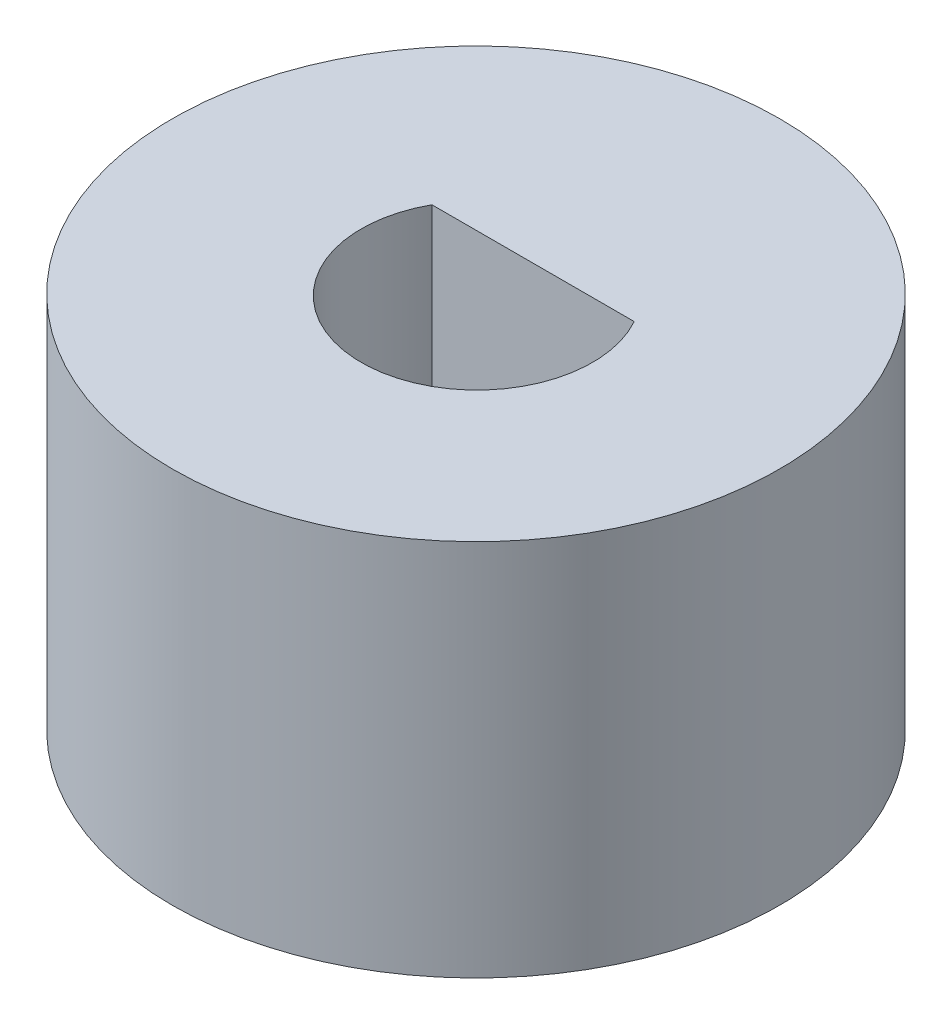
ISO-10303-21;
HEADER;
FILE_DESCRIPTION(('STEP AP214'),'2;1');
FILE_NAME('part.step','',(''),(''),'','','');
FILE_SCHEMA(('AUTOMOTIVE_DESIGN { 1 0 10303 214 1 1 1 1 }'));
ENDSEC;
DATA;
#1=APPLICATION_CONTEXT('core data for automotive mechanical design processes');
#2=APPLICATION_PROTOCOL_DEFINITION('international standard','automotive_design',2000,#1);
#3=PRODUCT_CONTEXT('',#1,'mechanical');
#4=PRODUCT('Part','Part','',(#3));
#5=PRODUCT_RELATED_PRODUCT_CATEGORY('part','',(#4));
#6=PRODUCT_DEFINITION_FORMATION('','',#4);
#7=PRODUCT_DEFINITION_CONTEXT('part definition',#1,'design');
#8=PRODUCT_DEFINITION('design','',#6,#7);
#9=PRODUCT_DEFINITION_SHAPE('','',#8);
#10=(LENGTH_UNIT() NAMED_UNIT(*) SI_UNIT(.MILLI.,.METRE.));
#11=(NAMED_UNIT(*) PLANE_ANGLE_UNIT() SI_UNIT($,.RADIAN.));
#12=(NAMED_UNIT(*) SI_UNIT($,.STERADIAN.) SOLID_ANGLE_UNIT());
#13=UNCERTAINTY_MEASURE_WITH_UNIT(LENGTH_MEASURE(1.E-05),#10,'distance_accuracy_value','');
#14=(GEOMETRIC_REPRESENTATION_CONTEXT(3) GLOBAL_UNCERTAINTY_ASSIGNED_CONTEXT((#13)) GLOBAL_UNIT_ASSIGNED_CONTEXT((#10,
#11,#12)) REPRESENTATION_CONTEXT('',''));
#15=CARTESIAN_POINT('',(0.,0.,0.));
#16=DIRECTION('',(0.,0.,1.));
#17=DIRECTION('',(1.,0.,0.));
#18=AXIS2_PLACEMENT_3D('',#15,#16,#17);
#19=CARTESIAN_POINT('',(0.,9.7,0.));
#20=DIRECTION('',(0.,1.,0.));
#21=DIRECTION('',(0.,0.,1.));
#22=AXIS2_PLACEMENT_3D('',#19,#20,#21);
#23=PLANE('',#22);
#24=CARTESIAN_POINT('',(0.,9.7,0.));
#25=DIRECTION('',(0.,1.,0.));
#26=DIRECTION('',(0.,0.,1.));
#27=AXIS2_PLACEMENT_3D('',#24,#25,#26);
#28=CIRCLE('',#27,8.595);
#29=CARTESIAN_POINT('',(0.,9.7,8.595));
#30=VERTEX_POINT('',#29);
#31=EDGE_CURVE('E11',#30,#30,#28,.T.);
#32=ORIENTED_EDGE('',*,*,#31,.T.);
#33=EDGE_LOOP('',(#32));
#34=FACE_BOUND('',#33,.T.);
#35=DIRECTION('',(-1.,0.,0.));
#36=VECTOR('',#35,1.);
#37=CARTESIAN_POINT('',(2.92106711556135,9.7,-1.559875966992));
#38=LINE('',#37,#36);
#39=CARTESIAN_POINT('',(2.92106711556135,9.7,-1.559875966992));
#40=VERTEX_POINT('',#39);
#41=CARTESIAN_POINT('',(-2.8065154639707,9.7,-1.559875966992));
#42=VERTEX_POINT('',#41);
#43=EDGE_CURVE('E60',#40,#42,#38,.T.);
#44=ORIENTED_EDGE('',*,*,#43,.F.);
#45=CARTESIAN_POINT('',(0.0572758257953213,9.7,0.0318342034080003));
#46=DIRECTION('',(0.,1.,0.));
#47=DIRECTION('',(0.,0.,-1.));
#48=AXIS2_PLACEMENT_3D('',#45,#46,#47);
#49=CIRCLE('',#48,3.2764068456);
#50=EDGE_CURVE('E82',#42,#40,#49,.T.);
#51=ORIENTED_EDGE('',*,*,#50,.F.);
#52=EDGE_LOOP('',(#44,#51));
#53=FACE_BOUND('',#52,.T.);
#54=ADVANCED_FACE('F39',(#34,#53),#23,.T.);
#55=CARTESIAN_POINT('',(0.,9.7,0.));
#56=DIRECTION('',(0.,-1.,0.));
#57=DIRECTION('',(0.,0.,-1.));
#58=AXIS2_PLACEMENT_3D('',#55,#56,#57);
#59=CYLINDRICAL_SURFACE('',#58,8.595);
#60=ORIENTED_EDGE('',*,*,#31,.F.);
#61=EDGE_LOOP('',(#60));
#62=FACE_BOUND('',#61,.T.);
#63=CARTESIAN_POINT('',(0.,-1.,0.));
#64=DIRECTION('',(0.,-1.,0.));
#65=DIRECTION('',(0.,0.,-1.));
#66=AXIS2_PLACEMENT_3D('',#63,#64,#65);
#67=CIRCLE('',#66,8.595);
#68=CARTESIAN_POINT('',(0.,-1.,-8.595));
#69=VERTEX_POINT('',#68);
#70=EDGE_CURVE('E78',#69,#69,#67,.T.);
#71=ORIENTED_EDGE('',*,*,#70,.F.);
#72=EDGE_LOOP('',(#71));
#73=FACE_BOUND('',#72,.T.);
#74=ADVANCED_FACE('F41',(#62,#73),#59,.T.);
#75=CARTESIAN_POINT('',(0.0572758257953213,9.7,0.0318342034080003));
#76=DIRECTION('',(0.,-1.,0.));
#77=DIRECTION('',(0.,0.,-1.));
#78=AXIS2_PLACEMENT_3D('',#75,#76,#77);
#79=CYLINDRICAL_SURFACE('',#78,3.2764068456);
#80=CARTESIAN_POINT('',(0.0572758257953213,0.,0.0318342034080003));
#81=DIRECTION('',(0.,1.,0.));
#82=DIRECTION('',(0.,0.,-1.));
#83=AXIS2_PLACEMENT_3D('',#80,#81,#82);
#84=CIRCLE('',#83,3.2764068456);
#85=CARTESIAN_POINT('',(-2.8065154639707,0.,-1.559875966992));
#86=VERTEX_POINT('',#85);
#87=CARTESIAN_POINT('',(2.92106711556135,0.,-1.559875966992));
#88=VERTEX_POINT('',#87);
#89=EDGE_CURVE('E74',#86,#88,#84,.T.);
#90=ORIENTED_EDGE('',*,*,#89,.F.);
#91=DIRECTION('',(0.,-1.,0.));
#92=VECTOR('',#91,1.);
#93=CARTESIAN_POINT('',(-2.8065154639707,9.7,-1.559875966992));
#94=LINE('',#93,#92);
#95=EDGE_CURVE('E64',#42,#86,#94,.T.);
#96=ORIENTED_EDGE('',*,*,#95,.F.);
#97=ORIENTED_EDGE('',*,*,#50,.T.);
#98=DIRECTION('',(0.,-1.,0.));
#99=VECTOR('',#98,1.);
#100=CARTESIAN_POINT('',(2.92106711556135,9.7,-1.559875966992));
#101=LINE('',#100,#99);
#102=EDGE_CURVE('E48',#40,#88,#101,.T.);
#103=ORIENTED_EDGE('',*,*,#102,.T.);
#104=EDGE_LOOP('',(#90,#96,#97,#103));
#105=FACE_BOUND('',#104,.T.);
#106=ADVANCED_FACE('F75',(#105),#79,.F.);
#107=CARTESIAN_POINT('',(2.92106711556135,9.7,-1.559875966992));
#108=DIRECTION('',(0.,0.,1.));
#109=DIRECTION('',(1.,0.,0.));
#110=AXIS2_PLACEMENT_3D('',#107,#108,#109);
#111=PLANE('',#110);
#112=DIRECTION('',(-1.,0.,0.));
#113=VECTOR('',#112,1.);
#114=CARTESIAN_POINT('',(2.92106711556135,0.,-1.559875966992));
#115=LINE('',#114,#113);
#116=EDGE_CURVE('E68',#88,#86,#115,.T.);
#117=ORIENTED_EDGE('',*,*,#116,.F.);
#118=ORIENTED_EDGE('',*,*,#102,.F.);
#119=ORIENTED_EDGE('',*,*,#43,.T.);
#120=ORIENTED_EDGE('',*,*,#95,.T.);
#121=EDGE_LOOP('',(#117,#118,#119,#120));
#122=FACE_BOUND('',#121,.T.);
#123=ADVANCED_FACE('F66',(#122),#111,.T.);
#124=CARTESIAN_POINT('',(0.,0.,0.));
#125=DIRECTION('',(0.,-1.,0.));
#126=DIRECTION('',(0.,0.,-1.));
#127=AXIS2_PLACEMENT_3D('',#124,#125,#126);
#128=PLANE('',#127);
#129=ORIENTED_EDGE('',*,*,#116,.T.);
#130=ORIENTED_EDGE('',*,*,#89,.T.);
#131=EDGE_LOOP('',(#129,#130));
#132=FACE_BOUND('',#131,.T.);
#133=ADVANCED_FACE('F80',(#132),#128,.F.);
#134=CARTESIAN_POINT('',(0.,-1.,0.));
#135=DIRECTION('',(0.,-1.,0.));
#136=DIRECTION('',(0.,0.,-1.));
#137=AXIS2_PLACEMENT_3D('',#134,#135,#136);
#138=PLANE('',#137);
#139=ORIENTED_EDGE('',*,*,#70,.T.);
#140=EDGE_LOOP('',(#139));
#141=FACE_BOUND('',#140,.T.);
#142=ADVANCED_FACE('F94',(#141),#138,.T.);
#143=CLOSED_SHELL('',(#54,#74,#106,#123,#133,#142));
#144=MANIFOLD_SOLID_BREP('B2',#143);
#145=ADVANCED_BREP_SHAPE_REPRESENTATION('',(#18,#144),#14);
#146=SHAPE_DEFINITION_REPRESENTATION(#9,#145);
ENDSEC;
END-ISO-10303-21;
